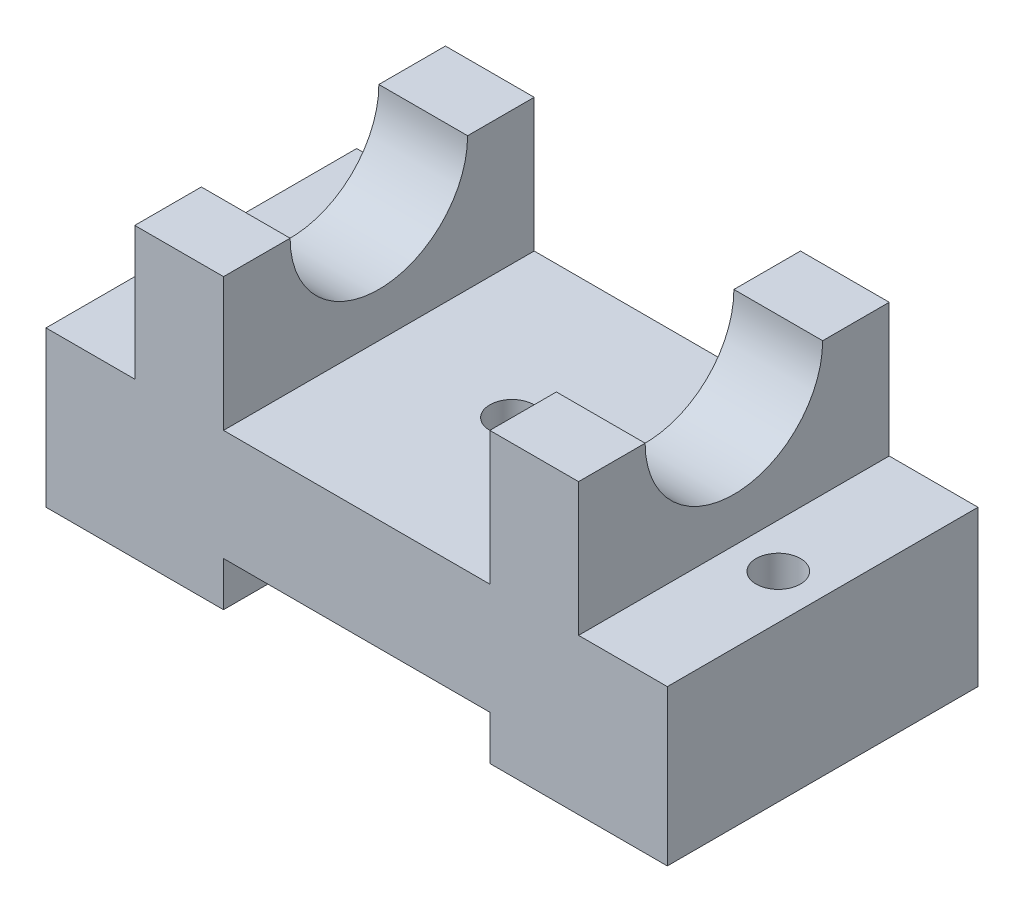
ISO-10303-21;
HEADER;
FILE_DESCRIPTION(('STEP AP214'),'2;1');
FILE_NAME('part.step','',(''),(''),'','','');
FILE_SCHEMA(('AUTOMOTIVE_DESIGN { 1 0 10303 214 1 1 1 1 }'));
ENDSEC;
DATA;
#1=APPLICATION_CONTEXT('core data for automotive mechanical design processes');
#2=APPLICATION_PROTOCOL_DEFINITION('international standard','automotive_design',2000,#1);
#3=PRODUCT_CONTEXT('',#1,'mechanical');
#4=PRODUCT('Part','Part','',(#3));
#5=PRODUCT_RELATED_PRODUCT_CATEGORY('part','',(#4));
#6=PRODUCT_DEFINITION_FORMATION('','',#4);
#7=PRODUCT_DEFINITION_CONTEXT('part definition',#1,'design');
#8=PRODUCT_DEFINITION('design','',#6,#7);
#9=PRODUCT_DEFINITION_SHAPE('','',#8);
#10=(LENGTH_UNIT() NAMED_UNIT(*) SI_UNIT(.MILLI.,.METRE.));
#11=(NAMED_UNIT(*) PLANE_ANGLE_UNIT() SI_UNIT($,.RADIAN.));
#12=(NAMED_UNIT(*) SI_UNIT($,.STERADIAN.) SOLID_ANGLE_UNIT());
#13=UNCERTAINTY_MEASURE_WITH_UNIT(LENGTH_MEASURE(1.E-05),#10,'distance_accuracy_value','');
#14=(GEOMETRIC_REPRESENTATION_CONTEXT(3) GLOBAL_UNCERTAINTY_ASSIGNED_CONTEXT((#13)) GLOBAL_UNIT_ASSIGNED_CONTEXT((#10,
#11,#12)) REPRESENTATION_CONTEXT('',''));
#15=CARTESIAN_POINT('',(0.,0.,0.));
#16=DIRECTION('',(0.,0.,1.));
#17=DIRECTION('',(1.,0.,0.));
#18=AXIS2_PLACEMENT_3D('',#15,#16,#17);
#19=CARTESIAN_POINT('',(40.,65.,-70.));
#20=DIRECTION('',(0.,1.,0.));
#21=DIRECTION('',(0.,0.,1.));
#22=AXIS2_PLACEMENT_3D('',#19,#20,#21);
#23=PLANE('',#22);
#24=DIRECTION('',(0.,0.,1.));
#25=VECTOR('',#24,1.);
#26=CARTESIAN_POINT('',(40.,65.,-70.));
#27=LINE('',#26,#25);
#28=CARTESIAN_POINT('',(40.,65.,-15.));
#29=VERTEX_POINT('',#28);
#30=CARTESIAN_POINT('',(40.,65.,0.));
#31=VERTEX_POINT('',#30);
#32=EDGE_CURVE('E331',#29,#31,#27,.T.);
#33=ORIENTED_EDGE('',*,*,#32,.F.);
#34=DIRECTION('',(-1.,0.,0.));
#35=VECTOR('',#34,1.);
#36=CARTESIAN_POINT('',(481.855640708479,65.,-15.));
#37=LINE('',#36,#35);
#38=CARTESIAN_POINT('',(20.,65.,-15.));
#39=VERTEX_POINT('',#38);
#40=EDGE_CURVE('E60',#29,#39,#37,.T.);
#41=ORIENTED_EDGE('',*,*,#40,.T.);
#42=DIRECTION('',(0.,0.,1.));
#43=VECTOR('',#42,1.);
#44=CARTESIAN_POINT('',(20.,65.,-70.));
#45=LINE('',#44,#43);
#46=CARTESIAN_POINT('',(20.,65.,0.));
#47=VERTEX_POINT('',#46);
#48=EDGE_CURVE('E327',#39,#47,#45,.T.);
#49=ORIENTED_EDGE('',*,*,#48,.T.);
#50=DIRECTION('',(-1.,0.,0.));
#51=VECTOR('',#50,1.);
#52=CARTESIAN_POINT('',(40.,65.,0.));
#53=LINE('',#52,#51);
#54=EDGE_CURVE('E305',#31,#47,#53,.T.);
#55=ORIENTED_EDGE('',*,*,#54,.F.);
#56=EDGE_LOOP('',(#33,#41,#49,#55));
#57=FACE_BOUND('',#56,.T.);
#58=ADVANCED_FACE('F43',(#57),#23,.T.);
#59=CARTESIAN_POINT('',(120.,65.,-70.));
#60=DIRECTION('',(0.,1.,0.));
#61=DIRECTION('',(0.,0.,1.));
#62=AXIS2_PLACEMENT_3D('',#59,#60,#61);
#63=PLANE('',#62);
#64=DIRECTION('',(0.,0.,1.));
#65=VECTOR('',#64,1.);
#66=CARTESIAN_POINT('',(120.,65.,-70.));
#67=LINE('',#66,#65);
#68=CARTESIAN_POINT('',(120.,65.,-15.));
#69=VERTEX_POINT('',#68);
#70=CARTESIAN_POINT('',(120.,65.,0.));
#71=VERTEX_POINT('',#70);
#72=EDGE_CURVE('E195',#69,#71,#67,.T.);
#73=ORIENTED_EDGE('',*,*,#72,.F.);
#74=CARTESIAN_POINT('',(100.,65.,-15.));
#75=VERTEX_POINT('',#74);
#76=EDGE_CURVE('E68',#69,#75,#37,.T.);
#77=ORIENTED_EDGE('',*,*,#76,.T.);
#78=DIRECTION('',(0.,0.,1.));
#79=VECTOR('',#78,1.);
#80=CARTESIAN_POINT('',(100.,65.,-70.));
#81=LINE('',#80,#79);
#82=CARTESIAN_POINT('',(100.,65.,0.));
#83=VERTEX_POINT('',#82);
#84=EDGE_CURVE('E193',#75,#83,#81,.T.);
#85=ORIENTED_EDGE('',*,*,#84,.T.);
#86=DIRECTION('',(-1.,0.,0.));
#87=VECTOR('',#86,1.);
#88=CARTESIAN_POINT('',(120.,65.,0.));
#89=LINE('',#88,#87);
#90=EDGE_CURVE('E292',#71,#83,#89,.T.);
#91=ORIENTED_EDGE('',*,*,#90,.F.);
#92=EDGE_LOOP('',(#73,#77,#85,#91));
#93=FACE_BOUND('',#92,.T.);
#94=ADVANCED_FACE('F191',(#93),#63,.T.);
#95=CARTESIAN_POINT('',(0.,35.,-70.));
#96=DIRECTION('',(-1.,0.,0.));
#97=DIRECTION('',(0.,0.,1.));
#98=AXIS2_PLACEMENT_3D('',#95,#96,#97);
#99=PLANE('',#98);
#100=DIRECTION('',(0.,-1.,0.));
#101=VECTOR('',#100,1.);
#102=CARTESIAN_POINT('',(0.,35.,0.));
#103=LINE('',#102,#101);
#104=CARTESIAN_POINT('',(0.,35.,0.));
#105=VERTEX_POINT('',#104);
#106=CARTESIAN_POINT('',(0.,0.,0.));
#107=VERTEX_POINT('',#106);
#108=EDGE_CURVE('E255',#105,#107,#103,.T.);
#109=ORIENTED_EDGE('',*,*,#108,.F.);
#110=DIRECTION('',(0.,0.,1.));
#111=VECTOR('',#110,1.);
#112=CARTESIAN_POINT('',(0.,35.,-70.));
#113=LINE('',#112,#111);
#114=CARTESIAN_POINT('',(0.,35.,-70.));
#115=VERTEX_POINT('',#114);
#116=EDGE_CURVE('E53',#115,#105,#113,.T.);
#117=ORIENTED_EDGE('',*,*,#116,.F.);
#118=DIRECTION('',(0.,-1.,0.));
#119=VECTOR('',#118,1.);
#120=CARTESIAN_POINT('',(0.,35.,-70.));
#121=LINE('',#120,#119);
#122=CARTESIAN_POINT('',(0.,0.,-70.));
#123=VERTEX_POINT('',#122);
#124=EDGE_CURVE('E317',#115,#123,#121,.T.);
#125=ORIENTED_EDGE('',*,*,#124,.T.);
#126=DIRECTION('',(0.,0.,1.));
#127=VECTOR('',#126,1.);
#128=CARTESIAN_POINT('',(0.,0.,-70.));
#129=LINE('',#128,#127);
#130=EDGE_CURVE('E236',#123,#107,#129,.T.);
#131=ORIENTED_EDGE('',*,*,#130,.T.);
#132=EDGE_LOOP('',(#109,#117,#125,#131));
#133=FACE_BOUND('',#132,.T.);
#134=ADVANCED_FACE('F45',(#133),#99,.T.);
#135=CARTESIAN_POINT('',(20.,35.,-70.));
#136=DIRECTION('',(0.,1.,0.));
#137=DIRECTION('',(0.,0.,1.));
#138=AXIS2_PLACEMENT_3D('',#135,#136,#137);
#139=PLANE('',#138);
#140=CARTESIAN_POINT('',(10.,35.,-35.));
#141=DIRECTION('',(0.,1.,0.));
#142=DIRECTION('',(-1.,0.,0.));
#143=AXIS2_PLACEMENT_3D('',#140,#141,#142);
#144=CIRCLE('',#143,5.);
#145=CARTESIAN_POINT('',(5.,35.,-35.));
#146=VERTEX_POINT('',#145);
#147=EDGE_CURVE('E520',#146,#146,#144,.T.);
#148=ORIENTED_EDGE('',*,*,#147,.F.);
#149=EDGE_LOOP('',(#148));
#150=FACE_BOUND('',#149,.T.);
#151=DIRECTION('',(-1.,0.,0.));
#152=VECTOR('',#151,1.);
#153=CARTESIAN_POINT('',(20.,35.,0.));
#154=LINE('',#153,#152);
#155=CARTESIAN_POINT('',(20.,35.,0.));
#156=VERTEX_POINT('',#155);
#157=EDGE_CURVE('E313',#156,#105,#154,.T.);
#158=ORIENTED_EDGE('',*,*,#157,.F.);
#159=DIRECTION('',(0.,0.,1.));
#160=VECTOR('',#159,1.);
#161=CARTESIAN_POINT('',(20.,35.,-70.));
#162=LINE('',#161,#160);
#163=CARTESIAN_POINT('',(20.,35.,-70.));
#164=VERTEX_POINT('',#163);
#165=EDGE_CURVE('E320',#164,#156,#162,.T.);
#166=ORIENTED_EDGE('',*,*,#165,.F.);
#167=DIRECTION('',(-1.,0.,0.));
#168=VECTOR('',#167,1.);
#169=CARTESIAN_POINT('',(20.,35.,-70.));
#170=LINE('',#169,#168);
#171=EDGE_CURVE('E238',#164,#115,#170,.T.);
#172=ORIENTED_EDGE('',*,*,#171,.T.);
#173=ORIENTED_EDGE('',*,*,#116,.T.);
#174=EDGE_LOOP('',(#158,#166,#172,#173));
#175=FACE_BOUND('',#174,.T.);
#176=ADVANCED_FACE('F437',(#150,#175),#139,.T.);
#177=CARTESIAN_POINT('',(20.,65.,-70.));
#178=DIRECTION('',(-1.,0.,0.));
#179=DIRECTION('',(0.,-1.,0.));
#180=AXIS2_PLACEMENT_3D('',#177,#178,#179);
#181=PLANE('',#180);
#182=ORIENTED_EDGE('',*,*,#48,.F.);
#183=CARTESIAN_POINT('',(20.,65.,-35.));
#184=DIRECTION('',(-1.,0.,0.));
#185=DIRECTION('',(0.,-1.,0.));
#186=AXIS2_PLACEMENT_3D('',#183,#184,#185);
#187=CIRCLE('',#186,20.);
#188=CARTESIAN_POINT('',(20.,65.,-55.));
#189=VERTEX_POINT('',#188);
#190=EDGE_CURVE('E260',#39,#189,#187,.F.);
#191=ORIENTED_EDGE('',*,*,#190,.T.);
#192=CARTESIAN_POINT('',(20.,65.,-70.));
#193=VERTEX_POINT('',#192);
#194=EDGE_CURVE('E323',#193,#189,#45,.T.);
#195=ORIENTED_EDGE('',*,*,#194,.F.);
#196=DIRECTION('',(0.,-1.,0.));
#197=VECTOR('',#196,1.);
#198=CARTESIAN_POINT('',(20.,65.,-70.));
#199=LINE('',#198,#197);
#200=EDGE_CURVE('E245',#193,#164,#199,.T.);
#201=ORIENTED_EDGE('',*,*,#200,.T.);
#202=ORIENTED_EDGE('',*,*,#165,.T.);
#203=DIRECTION('',(0.,-1.,0.));
#204=VECTOR('',#203,1.);
#205=CARTESIAN_POINT('',(20.,65.,0.));
#206=LINE('',#205,#204);
#207=EDGE_CURVE('E309',#47,#156,#206,.T.);
#208=ORIENTED_EDGE('',*,*,#207,.F.);
#209=EDGE_LOOP('',(#182,#191,#195,#201,#202,#208));
#210=FACE_BOUND('',#209,.T.);
#211=ADVANCED_FACE('F436',(#210),#181,.T.);
#212=DIRECTION('',(-1.,0.,0.));
#213=VECTOR('',#212,1.);
#214=CARTESIAN_POINT('',(481.855640708479,65.,-55.));
#215=LINE('',#214,#213);
#216=CARTESIAN_POINT('',(40.,65.,-55.));
#217=VERTEX_POINT('',#216);
#218=EDGE_CURVE('E197',#217,#189,#215,.T.);
#219=ORIENTED_EDGE('',*,*,#218,.F.);
#220=CARTESIAN_POINT('',(40.,65.,-70.));
#221=VERTEX_POINT('',#220);
#222=EDGE_CURVE('E328',#221,#217,#27,.T.);
#223=ORIENTED_EDGE('',*,*,#222,.F.);
#224=DIRECTION('',(-1.,0.,0.));
#225=VECTOR('',#224,1.);
#226=CARTESIAN_POINT('',(40.,65.,-70.));
#227=LINE('',#226,#225);
#228=EDGE_CURVE('E251',#221,#193,#227,.T.);
#229=ORIENTED_EDGE('',*,*,#228,.T.);
#230=ORIENTED_EDGE('',*,*,#194,.T.);
#231=EDGE_LOOP('',(#219,#223,#229,#230));
#232=FACE_BOUND('',#231,.T.);
#233=ADVANCED_FACE('F420',(#232),#23,.T.);
#234=CARTESIAN_POINT('',(40.,35.,-70.));
#235=DIRECTION('',(1.,0.,0.));
#236=DIRECTION('',(0.,1.,0.));
#237=AXIS2_PLACEMENT_3D('',#234,#235,#236);
#238=PLANE('',#237);
#239=ORIENTED_EDGE('',*,*,#222,.T.);
#240=CARTESIAN_POINT('',(40.,65.,-35.));
#241=DIRECTION('',(1.,0.,0.));
#242=DIRECTION('',(0.,1.,0.));
#243=AXIS2_PLACEMENT_3D('',#240,#241,#242);
#244=CIRCLE('',#243,20.);
#245=EDGE_CURVE('E187',#217,#29,#244,.F.);
#246=ORIENTED_EDGE('',*,*,#245,.T.);
#247=ORIENTED_EDGE('',*,*,#32,.T.);
#248=DIRECTION('',(0.,1.,0.));
#249=VECTOR('',#248,1.);
#250=CARTESIAN_POINT('',(40.,35.,0.));
#251=LINE('',#250,#249);
#252=CARTESIAN_POINT('',(40.,35.,0.));
#253=VERTEX_POINT('',#252);
#254=EDGE_CURVE('E301',#253,#31,#251,.T.);
#255=ORIENTED_EDGE('',*,*,#254,.F.);
#256=DIRECTION('',(0.,0.,1.));
#257=VECTOR('',#256,1.);
#258=CARTESIAN_POINT('',(40.,35.,-70.));
#259=LINE('',#258,#257);
#260=CARTESIAN_POINT('',(40.,35.,-70.));
#261=VERTEX_POINT('',#260);
#262=EDGE_CURVE('E332',#261,#253,#259,.T.);
#263=ORIENTED_EDGE('',*,*,#262,.F.);
#264=DIRECTION('',(0.,1.,0.));
#265=VECTOR('',#264,1.);
#266=CARTESIAN_POINT('',(40.,35.,-70.));
#267=LINE('',#266,#265);
#268=EDGE_CURVE('E412',#261,#221,#267,.T.);
#269=ORIENTED_EDGE('',*,*,#268,.T.);
#270=EDGE_LOOP('',(#239,#246,#247,#255,#263,#269));
#271=FACE_BOUND('',#270,.T.);
#272=ADVANCED_FACE('F427',(#271),#238,.T.);
#273=CARTESIAN_POINT('',(100.,35.,-70.));
#274=DIRECTION('',(0.,1.,0.));
#275=DIRECTION('',(-1.,0.,0.));
#276=AXIS2_PLACEMENT_3D('',#273,#274,#275);
#277=PLANE('',#276);
#278=CARTESIAN_POINT('',(70.,35.,-35.));
#279=DIRECTION('',(0.,1.,0.));
#280=DIRECTION('',(-1.,0.,0.));
#281=AXIS2_PLACEMENT_3D('',#278,#279,#280);
#282=CIRCLE('',#281,5.00000000000001);
#283=CARTESIAN_POINT('',(65.,35.,-35.));
#284=VERTEX_POINT('',#283);
#285=EDGE_CURVE('E362',#284,#284,#282,.T.);
#286=ORIENTED_EDGE('',*,*,#285,.F.);
#287=EDGE_LOOP('',(#286));
#288=FACE_BOUND('',#287,.T.);
#289=DIRECTION('',(-1.,0.,0.));
#290=VECTOR('',#289,1.);
#291=CARTESIAN_POINT('',(100.,35.,0.));
#292=LINE('',#291,#290);
#293=CARTESIAN_POINT('',(100.,35.,0.));
#294=VERTEX_POINT('',#293);
#295=EDGE_CURVE('E297',#294,#253,#292,.T.);
#296=ORIENTED_EDGE('',*,*,#295,.F.);
#297=DIRECTION('',(0.,0.,1.));
#298=VECTOR('',#297,1.);
#299=CARTESIAN_POINT('',(100.,35.,-70.));
#300=LINE('',#299,#298);
#301=CARTESIAN_POINT('',(100.,35.,-70.));
#302=VERTEX_POINT('',#301);
#303=EDGE_CURVE('E209',#302,#294,#300,.T.);
#304=ORIENTED_EDGE('',*,*,#303,.F.);
#305=DIRECTION('',(-1.,0.,0.));
#306=VECTOR('',#305,1.);
#307=CARTESIAN_POINT('',(100.,35.,-70.));
#308=LINE('',#307,#306);
#309=EDGE_CURVE('E409',#302,#261,#308,.T.);
#310=ORIENTED_EDGE('',*,*,#309,.T.);
#311=ORIENTED_EDGE('',*,*,#262,.T.);
#312=EDGE_LOOP('',(#296,#304,#310,#311));
#313=FACE_BOUND('',#312,.T.);
#314=ADVANCED_FACE('F344',(#288,#313),#277,.T.);
#315=CARTESIAN_POINT('',(100.,65.,-70.));
#316=DIRECTION('',(-1.,0.,0.));
#317=DIRECTION('',(0.,0.,1.));
#318=AXIS2_PLACEMENT_3D('',#315,#316,#317);
#319=PLANE('',#318);
#320=ORIENTED_EDGE('',*,*,#84,.F.);
#321=CARTESIAN_POINT('',(100.,65.,-35.));
#322=DIRECTION('',(-1.,0.,0.));
#323=DIRECTION('',(0.,0.,1.));
#324=AXIS2_PLACEMENT_3D('',#321,#322,#323);
#325=CIRCLE('',#324,20.);
#326=CARTESIAN_POINT('',(100.,65.,-55.));
#327=VERTEX_POINT('',#326);
#328=EDGE_CURVE('E179',#75,#327,#325,.F.);
#329=ORIENTED_EDGE('',*,*,#328,.T.);
#330=CARTESIAN_POINT('',(100.,65.,-70.));
#331=VERTEX_POINT('',#330);
#332=EDGE_CURVE('E204',#331,#327,#81,.T.);
#333=ORIENTED_EDGE('',*,*,#332,.F.);
#334=DIRECTION('',(0.,-1.,0.));
#335=VECTOR('',#334,1.);
#336=CARTESIAN_POINT('',(100.,65.,-70.));
#337=LINE('',#336,#335);
#338=EDGE_CURVE('E342',#331,#302,#337,.T.);
#339=ORIENTED_EDGE('',*,*,#338,.T.);
#340=ORIENTED_EDGE('',*,*,#303,.T.);
#341=DIRECTION('',(0.,-1.,0.));
#342=VECTOR('',#341,1.);
#343=CARTESIAN_POINT('',(100.,65.,0.));
#344=LINE('',#343,#342);
#345=EDGE_CURVE('E201',#83,#294,#344,.T.);
#346=ORIENTED_EDGE('',*,*,#345,.F.);
#347=EDGE_LOOP('',(#320,#329,#333,#339,#340,#346));
#348=FACE_BOUND('',#347,.T.);
#349=ADVANCED_FACE('F199',(#348),#319,.T.);
#350=CARTESIAN_POINT('',(120.,65.,-55.));
#351=VERTEX_POINT('',#350);
#352=EDGE_CURVE('E182',#351,#327,#215,.T.);
#353=ORIENTED_EDGE('',*,*,#352,.F.);
#354=CARTESIAN_POINT('',(120.,65.,-70.));
#355=VERTEX_POINT('',#354);
#356=EDGE_CURVE('E205',#355,#351,#67,.T.);
#357=ORIENTED_EDGE('',*,*,#356,.F.);
#358=DIRECTION('',(-1.,0.,0.));
#359=VECTOR('',#358,1.);
#360=CARTESIAN_POINT('',(120.,65.,-70.));
#361=LINE('',#360,#359);
#362=EDGE_CURVE('E404',#355,#331,#361,.T.);
#363=ORIENTED_EDGE('',*,*,#362,.T.);
#364=ORIENTED_EDGE('',*,*,#332,.T.);
#365=EDGE_LOOP('',(#353,#357,#363,#364));
#366=FACE_BOUND('',#365,.T.);
#367=ADVANCED_FACE('F355',(#366),#63,.T.);
#368=CARTESIAN_POINT('',(120.,35.,-70.));
#369=DIRECTION('',(1.,0.,0.));
#370=DIRECTION('',(0.,0.,-1.));
#371=AXIS2_PLACEMENT_3D('',#368,#369,#370);
#372=PLANE('',#371);
#373=ORIENTED_EDGE('',*,*,#356,.T.);
#374=CARTESIAN_POINT('',(120.,65.,-35.));
#375=DIRECTION('',(1.,0.,0.));
#376=DIRECTION('',(0.,0.,-1.));
#377=AXIS2_PLACEMENT_3D('',#374,#375,#376);
#378=CIRCLE('',#377,20.);
#379=EDGE_CURVE('E11',#351,#69,#378,.F.);
#380=ORIENTED_EDGE('',*,*,#379,.T.);
#381=ORIENTED_EDGE('',*,*,#72,.T.);
#382=DIRECTION('',(0.,1.,0.));
#383=VECTOR('',#382,1.);
#384=CARTESIAN_POINT('',(120.,35.,0.));
#385=LINE('',#384,#383);
#386=CARTESIAN_POINT('',(120.,35.,0.));
#387=VERTEX_POINT('',#386);
#388=EDGE_CURVE('E288',#387,#71,#385,.T.);
#389=ORIENTED_EDGE('',*,*,#388,.F.);
#390=DIRECTION('',(0.,0.,1.));
#391=VECTOR('',#390,1.);
#392=CARTESIAN_POINT('',(120.,35.,-70.));
#393=LINE('',#392,#391);
#394=CARTESIAN_POINT('',(120.,35.,-70.));
#395=VERTEX_POINT('',#394);
#396=EDGE_CURVE('E215',#395,#387,#393,.T.);
#397=ORIENTED_EDGE('',*,*,#396,.F.);
#398=DIRECTION('',(0.,1.,0.));
#399=VECTOR('',#398,1.);
#400=CARTESIAN_POINT('',(120.,35.,-70.));
#401=LINE('',#400,#399);
#402=EDGE_CURVE('E401',#395,#355,#401,.T.);
#403=ORIENTED_EDGE('',*,*,#402,.T.);
#404=EDGE_LOOP('',(#373,#380,#381,#389,#397,#403));
#405=FACE_BOUND('',#404,.T.);
#406=ADVANCED_FACE('F350',(#405),#372,.T.);
#407=CARTESIAN_POINT('',(140.,35.,-70.));
#408=DIRECTION('',(0.,1.,0.));
#409=DIRECTION('',(0.,0.,1.));
#410=AXIS2_PLACEMENT_3D('',#407,#408,#409);
#411=PLANE('',#410);
#412=CARTESIAN_POINT('',(130.,35.,-35.));
#413=DIRECTION('',(0.,1.,0.));
#414=DIRECTION('',(-1.,0.,0.));
#415=AXIS2_PLACEMENT_3D('',#412,#413,#414);
#416=CIRCLE('',#415,4.99999999999999);
#417=CARTESIAN_POINT('',(125.,35.,-35.));
#418=VERTEX_POINT('',#417);
#419=EDGE_CURVE('E518',#418,#418,#416,.T.);
#420=ORIENTED_EDGE('',*,*,#419,.F.);
#421=EDGE_LOOP('',(#420));
#422=FACE_BOUND('',#421,.T.);
#423=DIRECTION('',(-1.,0.,0.));
#424=VECTOR('',#423,1.);
#425=CARTESIAN_POINT('',(140.,35.,0.));
#426=LINE('',#425,#424);
#427=CARTESIAN_POINT('',(140.,35.,0.));
#428=VERTEX_POINT('',#427);
#429=EDGE_CURVE('E284',#428,#387,#426,.T.);
#430=ORIENTED_EDGE('',*,*,#429,.F.);
#431=DIRECTION('',(0.,0.,1.));
#432=VECTOR('',#431,1.);
#433=CARTESIAN_POINT('',(140.,35.,-70.));
#434=LINE('',#433,#432);
#435=CARTESIAN_POINT('',(140.,35.,-70.));
#436=VERTEX_POINT('',#435);
#437=EDGE_CURVE('E218',#436,#428,#434,.T.);
#438=ORIENTED_EDGE('',*,*,#437,.F.);
#439=DIRECTION('',(-1.,0.,0.));
#440=VECTOR('',#439,1.);
#441=CARTESIAN_POINT('',(140.,35.,-70.));
#442=LINE('',#441,#440);
#443=EDGE_CURVE('E397',#436,#395,#442,.T.);
#444=ORIENTED_EDGE('',*,*,#443,.T.);
#445=ORIENTED_EDGE('',*,*,#396,.T.);
#446=EDGE_LOOP('',(#430,#438,#444,#445));
#447=FACE_BOUND('',#446,.T.);
#448=ADVANCED_FACE('F463',(#422,#447),#411,.T.);
#449=CARTESIAN_POINT('',(140.,0.,-70.));
#450=DIRECTION('',(1.,0.,0.));
#451=DIRECTION('',(0.,0.,-1.));
#452=AXIS2_PLACEMENT_3D('',#449,#450,#451);
#453=PLANE('',#452);
#454=DIRECTION('',(0.,1.,0.));
#455=VECTOR('',#454,1.);
#456=CARTESIAN_POINT('',(140.,0.,0.));
#457=LINE('',#456,#455);
#458=CARTESIAN_POINT('',(140.,0.,0.));
#459=VERTEX_POINT('',#458);
#460=EDGE_CURVE('E280',#459,#428,#457,.T.);
#461=ORIENTED_EDGE('',*,*,#460,.F.);
#462=DIRECTION('',(0.,0.,1.));
#463=VECTOR('',#462,1.);
#464=CARTESIAN_POINT('',(140.,0.,-70.));
#465=LINE('',#464,#463);
#466=CARTESIAN_POINT('',(140.,0.,-70.));
#467=VERTEX_POINT('',#466);
#468=EDGE_CURVE('E221',#467,#459,#465,.T.);
#469=ORIENTED_EDGE('',*,*,#468,.F.);
#470=DIRECTION('',(0.,1.,0.));
#471=VECTOR('',#470,1.);
#472=CARTESIAN_POINT('',(140.,0.,-70.));
#473=LINE('',#472,#471);
#474=EDGE_CURVE('E393',#467,#436,#473,.T.);
#475=ORIENTED_EDGE('',*,*,#474,.T.);
#476=ORIENTED_EDGE('',*,*,#437,.T.);
#477=EDGE_LOOP('',(#461,#469,#475,#476));
#478=FACE_BOUND('',#477,.T.);
#479=ADVANCED_FACE('F459',(#478),#453,.T.);
#480=CARTESIAN_POINT('',(100.,0.,-70.));
#481=DIRECTION('',(0.,-1.,0.));
#482=DIRECTION('',(0.,0.,-1.));
#483=AXIS2_PLACEMENT_3D('',#480,#481,#482);
#484=PLANE('',#483);
#485=CARTESIAN_POINT('',(130.,0.,-35.));
#486=DIRECTION('',(0.,1.,0.));
#487=DIRECTION('',(-1.,0.,0.));
#488=AXIS2_PLACEMENT_3D('',#485,#486,#487);
#489=CIRCLE('',#488,4.99999999999999);
#490=CARTESIAN_POINT('',(125.,0.,-35.));
#491=VERTEX_POINT('',#490);
#492=EDGE_CURVE('E516',#491,#491,#489,.T.);
#493=ORIENTED_EDGE('',*,*,#492,.T.);
#494=EDGE_LOOP('',(#493));
#495=FACE_BOUND('',#494,.T.);
#496=DIRECTION('',(1.,0.,0.));
#497=VECTOR('',#496,1.);
#498=CARTESIAN_POINT('',(100.,0.,0.));
#499=LINE('',#498,#497);
#500=CARTESIAN_POINT('',(100.,0.,0.));
#501=VERTEX_POINT('',#500);
#502=EDGE_CURVE('E276',#501,#459,#499,.T.);
#503=ORIENTED_EDGE('',*,*,#502,.F.);
#504=DIRECTION('',(0.,0.,1.));
#505=VECTOR('',#504,1.);
#506=CARTESIAN_POINT('',(100.,0.,-70.));
#507=LINE('',#506,#505);
#508=CARTESIAN_POINT('',(100.,0.,-70.));
#509=VERTEX_POINT('',#508);
#510=EDGE_CURVE('E224',#509,#501,#507,.T.);
#511=ORIENTED_EDGE('',*,*,#510,.F.);
#512=DIRECTION('',(1.,0.,0.));
#513=VECTOR('',#512,1.);
#514=CARTESIAN_POINT('',(100.,0.,-70.));
#515=LINE('',#514,#513);
#516=EDGE_CURVE('E389',#509,#467,#515,.T.);
#517=ORIENTED_EDGE('',*,*,#516,.T.);
#518=ORIENTED_EDGE('',*,*,#468,.T.);
#519=EDGE_LOOP('',(#503,#511,#517,#518));
#520=FACE_BOUND('',#519,.T.);
#521=ADVANCED_FACE('F456',(#495,#520),#484,.T.);
#522=CARTESIAN_POINT('',(100.,10.,-70.));
#523=DIRECTION('',(-1.,0.,0.));
#524=DIRECTION('',(0.,0.,1.));
#525=AXIS2_PLACEMENT_3D('',#522,#523,#524);
#526=PLANE('',#525);
#527=DIRECTION('',(0.,-1.,0.));
#528=VECTOR('',#527,1.);
#529=CARTESIAN_POINT('',(100.,10.,0.));
#530=LINE('',#529,#528);
#531=CARTESIAN_POINT('',(100.,10.,0.));
#532=VERTEX_POINT('',#531);
#533=EDGE_CURVE('E272',#532,#501,#530,.T.);
#534=ORIENTED_EDGE('',*,*,#533,.F.);
#535=DIRECTION('',(0.,0.,1.));
#536=VECTOR('',#535,1.);
#537=CARTESIAN_POINT('',(100.,10.,-70.));
#538=LINE('',#537,#536);
#539=CARTESIAN_POINT('',(100.,10.,-70.));
#540=VERTEX_POINT('',#539);
#541=EDGE_CURVE('E227',#540,#532,#538,.T.);
#542=ORIENTED_EDGE('',*,*,#541,.F.);
#543=DIRECTION('',(0.,-1.,0.));
#544=VECTOR('',#543,1.);
#545=CARTESIAN_POINT('',(100.,10.,-70.));
#546=LINE('',#545,#544);
#547=EDGE_CURVE('E385',#540,#509,#546,.T.);
#548=ORIENTED_EDGE('',*,*,#547,.T.);
#549=ORIENTED_EDGE('',*,*,#510,.T.);
#550=EDGE_LOOP('',(#534,#542,#548,#549));
#551=FACE_BOUND('',#550,.T.);
#552=ADVANCED_FACE('F452',(#551),#526,.T.);
#553=CARTESIAN_POINT('',(40.,10.,-70.));
#554=DIRECTION('',(0.,-1.,0.));
#555=DIRECTION('',(0.,0.,-1.));
#556=AXIS2_PLACEMENT_3D('',#553,#554,#555);
#557=PLANE('',#556);
#558=CARTESIAN_POINT('',(70.,10.,-35.));
#559=DIRECTION('',(0.,-1.,0.));
#560=DIRECTION('',(0.,0.,-1.));
#561=AXIS2_PLACEMENT_3D('',#558,#559,#560);
#562=CIRCLE('',#561,5.00000000000001);
#563=CARTESIAN_POINT('',(70.,10.,-40.));
#564=VERTEX_POINT('',#563);
#565=EDGE_CURVE('E47',#564,#564,#562,.T.);
#566=ORIENTED_EDGE('',*,*,#565,.F.);
#567=EDGE_LOOP('',(#566));
#568=FACE_BOUND('',#567,.T.);
#569=DIRECTION('',(1.,0.,0.));
#570=VECTOR('',#569,1.);
#571=CARTESIAN_POINT('',(40.,10.,0.));
#572=LINE('',#571,#570);
#573=CARTESIAN_POINT('',(40.,10.,0.));
#574=VERTEX_POINT('',#573);
#575=EDGE_CURVE('E268',#574,#532,#572,.T.);
#576=ORIENTED_EDGE('',*,*,#575,.F.);
#577=DIRECTION('',(0.,0.,1.));
#578=VECTOR('',#577,1.);
#579=CARTESIAN_POINT('',(40.,10.,-70.));
#580=LINE('',#579,#578);
#581=CARTESIAN_POINT('',(40.,10.,-70.));
#582=VERTEX_POINT('',#581);
#583=EDGE_CURVE('E230',#582,#574,#580,.T.);
#584=ORIENTED_EDGE('',*,*,#583,.F.);
#585=DIRECTION('',(1.,0.,0.));
#586=VECTOR('',#585,1.);
#587=CARTESIAN_POINT('',(40.,10.,-70.));
#588=LINE('',#587,#586);
#589=EDGE_CURVE('E381',#582,#540,#588,.T.);
#590=ORIENTED_EDGE('',*,*,#589,.T.);
#591=ORIENTED_EDGE('',*,*,#541,.T.);
#592=EDGE_LOOP('',(#576,#584,#590,#591));
#593=FACE_BOUND('',#592,.T.);
#594=ADVANCED_FACE('F449',(#568,#593),#557,.T.);
#595=CARTESIAN_POINT('',(40.,0.,-70.));
#596=DIRECTION('',(1.,0.,0.));
#597=DIRECTION('',(0.,1.,0.));
#598=AXIS2_PLACEMENT_3D('',#595,#596,#597);
#599=PLANE('',#598);
#600=DIRECTION('',(0.,1.,0.));
#601=VECTOR('',#600,1.);
#602=CARTESIAN_POINT('',(40.,0.,0.));
#603=LINE('',#602,#601);
#604=CARTESIAN_POINT('',(40.,0.,0.));
#605=VERTEX_POINT('',#604);
#606=EDGE_CURVE('E264',#605,#574,#603,.T.);
#607=ORIENTED_EDGE('',*,*,#606,.F.);
#608=DIRECTION('',(0.,0.,1.));
#609=VECTOR('',#608,1.);
#610=CARTESIAN_POINT('',(40.,0.,-70.));
#611=LINE('',#610,#609);
#612=CARTESIAN_POINT('',(40.,0.,-70.));
#613=VERTEX_POINT('',#612);
#614=EDGE_CURVE('E233',#613,#605,#611,.T.);
#615=ORIENTED_EDGE('',*,*,#614,.F.);
#616=DIRECTION('',(0.,1.,0.));
#617=VECTOR('',#616,1.);
#618=CARTESIAN_POINT('',(40.,0.,-70.));
#619=LINE('',#618,#617);
#620=EDGE_CURVE('E377',#613,#582,#619,.T.);
#621=ORIENTED_EDGE('',*,*,#620,.T.);
#622=ORIENTED_EDGE('',*,*,#583,.T.);
#623=EDGE_LOOP('',(#607,#615,#621,#622));
#624=FACE_BOUND('',#623,.T.);
#625=ADVANCED_FACE('F445',(#624),#599,.T.);
#626=CARTESIAN_POINT('',(0.,0.,-70.));
#627=DIRECTION('',(0.,-1.,0.));
#628=DIRECTION('',(0.,0.,-1.));
#629=AXIS2_PLACEMENT_3D('',#626,#627,#628);
#630=PLANE('',#629);
#631=CARTESIAN_POINT('',(10.,0.,-35.));
#632=DIRECTION('',(0.,1.,0.));
#633=DIRECTION('',(-1.,0.,0.));
#634=AXIS2_PLACEMENT_3D('',#631,#632,#633);
#635=CIRCLE('',#634,5.);
#636=CARTESIAN_POINT('',(5.00000000000001,0.,-35.));
#637=VERTEX_POINT('',#636);
#638=EDGE_CURVE('E526',#637,#637,#635,.T.);
#639=ORIENTED_EDGE('',*,*,#638,.T.);
#640=EDGE_LOOP('',(#639));
#641=FACE_BOUND('',#640,.T.);
#642=DIRECTION('',(1.,0.,0.));
#643=VECTOR('',#642,1.);
#644=CARTESIAN_POINT('',(0.,0.,0.));
#645=LINE('',#644,#643);
#646=EDGE_CURVE('E259',#107,#605,#645,.T.);
#647=ORIENTED_EDGE('',*,*,#646,.F.);
#648=ORIENTED_EDGE('',*,*,#130,.F.);
#649=DIRECTION('',(1.,0.,0.));
#650=VECTOR('',#649,1.);
#651=CARTESIAN_POINT('',(0.,0.,-70.));
#652=LINE('',#651,#650);
#653=EDGE_CURVE('E373',#123,#613,#652,.T.);
#654=ORIENTED_EDGE('',*,*,#653,.T.);
#655=ORIENTED_EDGE('',*,*,#614,.T.);
#656=EDGE_LOOP('',(#647,#648,#654,#655));
#657=FACE_BOUND('',#656,.T.);
#658=ADVANCED_FACE('F442',(#641,#657),#630,.T.);
#659=CARTESIAN_POINT('',(0.,0.,-70.));
#660=DIRECTION('',(0.,0.,1.));
#661=DIRECTION('',(1.,0.,0.));
#662=AXIS2_PLACEMENT_3D('',#659,#660,#661);
#663=PLANE('',#662);
#664=ORIENTED_EDGE('',*,*,#124,.F.);
#665=ORIENTED_EDGE('',*,*,#171,.F.);
#666=ORIENTED_EDGE('',*,*,#200,.F.);
#667=ORIENTED_EDGE('',*,*,#228,.F.);
#668=ORIENTED_EDGE('',*,*,#268,.F.);
#669=ORIENTED_EDGE('',*,*,#309,.F.);
#670=ORIENTED_EDGE('',*,*,#338,.F.);
#671=ORIENTED_EDGE('',*,*,#362,.F.);
#672=ORIENTED_EDGE('',*,*,#402,.F.);
#673=ORIENTED_EDGE('',*,*,#443,.F.);
#674=ORIENTED_EDGE('',*,*,#474,.F.);
#675=ORIENTED_EDGE('',*,*,#516,.F.);
#676=ORIENTED_EDGE('',*,*,#547,.F.);
#677=ORIENTED_EDGE('',*,*,#589,.F.);
#678=ORIENTED_EDGE('',*,*,#620,.F.);
#679=ORIENTED_EDGE('',*,*,#653,.F.);
#680=EDGE_LOOP('',(#664,#665,#666,#667,#668,#669,#670,#671,#672,#673,#674,#675,#676,#677,#678,#679));
#681=FACE_BOUND('',#680,.T.);
#682=ADVANCED_FACE('F425',(#681),#663,.F.);
#683=CARTESIAN_POINT('',(0.,0.,0.));
#684=DIRECTION('',(0.,0.,1.));
#685=DIRECTION('',(1.,0.,0.));
#686=AXIS2_PLACEMENT_3D('',#683,#684,#685);
#687=PLANE('',#686);
#688=ORIENTED_EDGE('',*,*,#108,.T.);
#689=ORIENTED_EDGE('',*,*,#646,.T.);
#690=ORIENTED_EDGE('',*,*,#606,.T.);
#691=ORIENTED_EDGE('',*,*,#575,.T.);
#692=ORIENTED_EDGE('',*,*,#533,.T.);
#693=ORIENTED_EDGE('',*,*,#502,.T.);
#694=ORIENTED_EDGE('',*,*,#460,.T.);
#695=ORIENTED_EDGE('',*,*,#429,.T.);
#696=ORIENTED_EDGE('',*,*,#388,.T.);
#697=ORIENTED_EDGE('',*,*,#90,.T.);
#698=ORIENTED_EDGE('',*,*,#345,.T.);
#699=ORIENTED_EDGE('',*,*,#295,.T.);
#700=ORIENTED_EDGE('',*,*,#254,.T.);
#701=ORIENTED_EDGE('',*,*,#54,.T.);
#702=ORIENTED_EDGE('',*,*,#207,.T.);
#703=ORIENTED_EDGE('',*,*,#157,.T.);
#704=EDGE_LOOP('',(#688,#689,#690,#691,#692,#693,#694,#695,#696,#697,#698,#699,#700,#701,#702,#703));
#705=FACE_BOUND('',#704,.T.);
#706=ADVANCED_FACE('F346',(#705),#687,.T.);
#707=CARTESIAN_POINT('',(481.855640708479,65.,-35.));
#708=DIRECTION('',(-1.,0.,0.));
#709=DIRECTION('',(0.,0.,1.));
#710=AXIS2_PLACEMENT_3D('',#707,#708,#709);
#711=CYLINDRICAL_SURFACE('',#710,20.);
#712=ORIENTED_EDGE('',*,*,#328,.F.);
#713=ORIENTED_EDGE('',*,*,#76,.F.);
#714=ORIENTED_EDGE('',*,*,#379,.F.);
#715=ORIENTED_EDGE('',*,*,#352,.T.);
#716=EDGE_LOOP('',(#712,#713,#714,#715));
#717=FACE_BOUND('',#716,.T.);
#718=ADVANCED_FACE('F180',(#717),#711,.F.);
#719=ORIENTED_EDGE('',*,*,#190,.F.);
#720=ORIENTED_EDGE('',*,*,#40,.F.);
#721=ORIENTED_EDGE('',*,*,#245,.F.);
#722=ORIENTED_EDGE('',*,*,#218,.T.);
#723=EDGE_LOOP('',(#719,#720,#721,#722));
#724=FACE_BOUND('',#723,.T.);
#725=ADVANCED_FACE('F499',(#724),#711,.F.);
#726=CARTESIAN_POINT('',(10.,0.,-35.));
#727=DIRECTION('',(0.,1.,0.));
#728=DIRECTION('',(-1.,0.,0.));
#729=AXIS2_PLACEMENT_3D('',#726,#727,#728);
#730=CYLINDRICAL_SURFACE('',#729,5.);
#731=ORIENTED_EDGE('',*,*,#638,.F.);
#732=EDGE_LOOP('',(#731));
#733=FACE_BOUND('',#732,.T.);
#734=ORIENTED_EDGE('',*,*,#147,.T.);
#735=EDGE_LOOP('',(#734));
#736=FACE_BOUND('',#735,.T.);
#737=ADVANCED_FACE('F504',(#733,#736),#730,.F.);
#738=CARTESIAN_POINT('',(70.,0.,-35.));
#739=DIRECTION('',(0.,1.,0.));
#740=DIRECTION('',(-1.,0.,0.));
#741=AXIS2_PLACEMENT_3D('',#738,#739,#740);
#742=CYLINDRICAL_SURFACE('',#741,5.00000000000001);
#743=ORIENTED_EDGE('',*,*,#565,.T.);
#744=EDGE_LOOP('',(#743));
#745=FACE_BOUND('',#744,.T.);
#746=ORIENTED_EDGE('',*,*,#285,.T.);
#747=EDGE_LOOP('',(#746));
#748=FACE_BOUND('',#747,.T.);
#749=ADVANCED_FACE('F500',(#745,#748),#742,.F.);
#750=CARTESIAN_POINT('',(130.,0.,-35.));
#751=DIRECTION('',(0.,1.,0.));
#752=DIRECTION('',(-1.,0.,0.));
#753=AXIS2_PLACEMENT_3D('',#750,#751,#752);
#754=CYLINDRICAL_SURFACE('',#753,4.99999999999999);
#755=ORIENTED_EDGE('',*,*,#492,.F.);
#756=EDGE_LOOP('',(#755));
#757=FACE_BOUND('',#756,.T.);
#758=ORIENTED_EDGE('',*,*,#419,.T.);
#759=EDGE_LOOP('',(#758));
#760=FACE_BOUND('',#759,.T.);
#761=ADVANCED_FACE('F503',(#757,#760),#754,.F.);
#762=CLOSED_SHELL('',(#58,#94,#134,#176,#211,#233,#272,#314,#349,#367,#406,#448,#479,#521,#552,
#594,#625,#658,#682,#706,#718,#725,#737,#749,#761));
#763=MANIFOLD_SOLID_BREP('B2',#762);
#764=ADVANCED_BREP_SHAPE_REPRESENTATION('',(#18,#763),#14);
#765=SHAPE_DEFINITION_REPRESENTATION(#9,#764);
ENDSEC;
END-ISO-10303-21;
